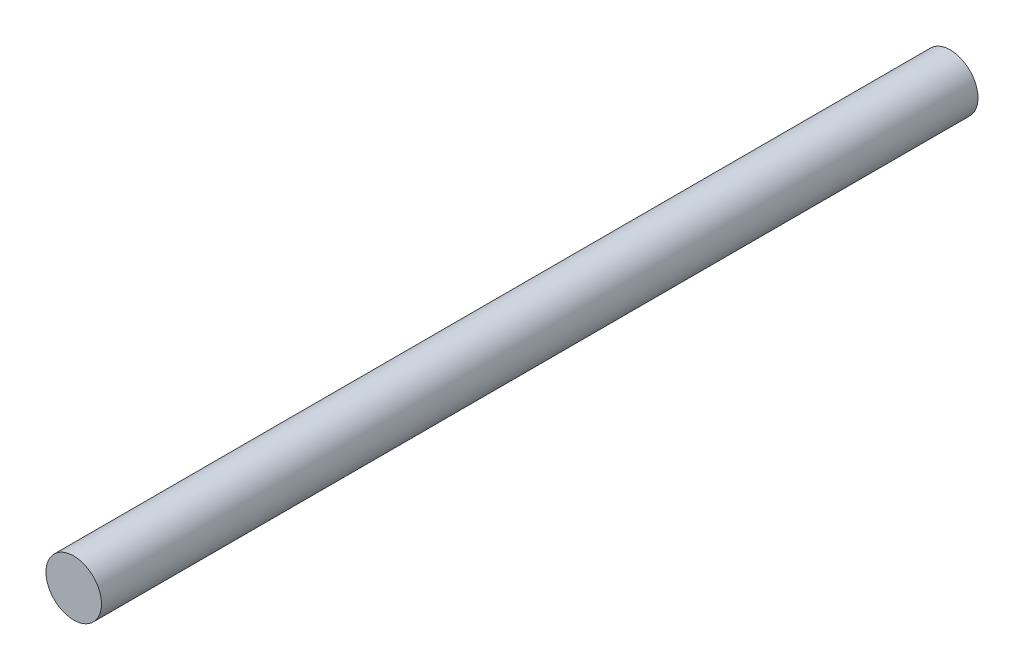
ISO-10303-21;
HEADER;
FILE_DESCRIPTION(('STEP AP214'),'2;1');
FILE_NAME('part.step','',(''),(''),'','','');
FILE_SCHEMA(('AUTOMOTIVE_DESIGN { 1 0 10303 214 1 1 1 1 }'));
ENDSEC;
DATA;
#1=APPLICATION_CONTEXT('core data for automotive mechanical design processes');
#2=APPLICATION_PROTOCOL_DEFINITION('international standard','automotive_design',2000,#1);
#3=PRODUCT_CONTEXT('',#1,'mechanical');
#4=PRODUCT('Part','Part','',(#3));
#5=PRODUCT_RELATED_PRODUCT_CATEGORY('part','',(#4));
#6=PRODUCT_DEFINITION_FORMATION('','',#4);
#7=PRODUCT_DEFINITION_CONTEXT('part definition',#1,'design');
#8=PRODUCT_DEFINITION('design','',#6,#7);
#9=PRODUCT_DEFINITION_SHAPE('','',#8);
#10=(LENGTH_UNIT() NAMED_UNIT(*) SI_UNIT(.MILLI.,.METRE.));
#11=(NAMED_UNIT(*) PLANE_ANGLE_UNIT() SI_UNIT($,.RADIAN.));
#12=(NAMED_UNIT(*) SI_UNIT($,.STERADIAN.) SOLID_ANGLE_UNIT());
#13=UNCERTAINTY_MEASURE_WITH_UNIT(LENGTH_MEASURE(1.E-05),#10,'distance_accuracy_value','');
#14=(GEOMETRIC_REPRESENTATION_CONTEXT(3) GLOBAL_UNCERTAINTY_ASSIGNED_CONTEXT((#13)) GLOBAL_UNIT_ASSIGNED_CONTEXT((#10,
#11,#12)) REPRESENTATION_CONTEXT('',''));
#15=CARTESIAN_POINT('',(0.,0.,0.));
#16=DIRECTION('',(0.,0.,1.));
#17=DIRECTION('',(1.,0.,0.));
#18=AXIS2_PLACEMENT_3D('',#15,#16,#17);
#19=CARTESIAN_POINT('',(0.,0.,30.));
#20=DIRECTION('',(0.,0.,-1.));
#21=DIRECTION('',(-1.,0.,0.));
#22=AXIS2_PLACEMENT_3D('',#19,#20,#21);
#23=CYLINDRICAL_SURFACE('',#22,1.9);
#24=CARTESIAN_POINT('',(0.,0.,30.));
#25=DIRECTION('',(0.,0.,1.));
#26=DIRECTION('',(1.,0.,0.));
#27=AXIS2_PLACEMENT_3D('',#24,#25,#26);
#28=CIRCLE('',#27,1.9);
#29=CARTESIAN_POINT('',(1.9,0.,30.));
#30=VERTEX_POINT('',#29);
#31=EDGE_CURVE('E10',#30,#30,#28,.T.);
#32=ORIENTED_EDGE('',*,*,#31,.F.);
#33=EDGE_LOOP('',(#32));
#34=FACE_BOUND('',#33,.T.);
#35=CARTESIAN_POINT('',(0.,0.,-30.));
#36=DIRECTION('',(0.,0.,1.));
#37=DIRECTION('',(1.,0.,0.));
#38=AXIS2_PLACEMENT_3D('',#35,#36,#37);
#39=CIRCLE('',#38,1.9);
#40=CARTESIAN_POINT('',(1.9,0.,-30.));
#41=VERTEX_POINT('',#40);
#42=EDGE_CURVE('E36',#41,#41,#39,.T.);
#43=ORIENTED_EDGE('',*,*,#42,.T.);
#44=EDGE_LOOP('',(#43));
#45=FACE_BOUND('',#44,.T.);
#46=ADVANCED_FACE('F33',(#34,#45),#23,.T.);
#47=CARTESIAN_POINT('',(0.,0.,30.));
#48=DIRECTION('',(0.,0.,1.));
#49=DIRECTION('',(1.,0.,0.));
#50=AXIS2_PLACEMENT_3D('',#47,#48,#49);
#51=PLANE('',#50);
#52=ORIENTED_EDGE('',*,*,#31,.T.);
#53=EDGE_LOOP('',(#52));
#54=FACE_BOUND('',#53,.T.);
#55=ADVANCED_FACE('F48',(#54),#51,.T.);
#56=CARTESIAN_POINT('',(0.,0.,-30.));
#57=DIRECTION('',(0.,0.,1.));
#58=DIRECTION('',(1.,0.,0.));
#59=AXIS2_PLACEMENT_3D('',#56,#57,#58);
#60=PLANE('',#59);
#61=ORIENTED_EDGE('',*,*,#42,.F.);
#62=EDGE_LOOP('',(#61));
#63=FACE_BOUND('',#62,.T.);
#64=ADVANCED_FACE('F46',(#63),#60,.F.);
#65=CLOSED_SHELL('',(#46,#55,#64));
#66=MANIFOLD_SOLID_BREP('B2',#65);
#67=ADVANCED_BREP_SHAPE_REPRESENTATION('',(#18,#66),#14);
#68=SHAPE_DEFINITION_REPRESENTATION(#9,#67);
ENDSEC;
END-ISO-10303-21;
